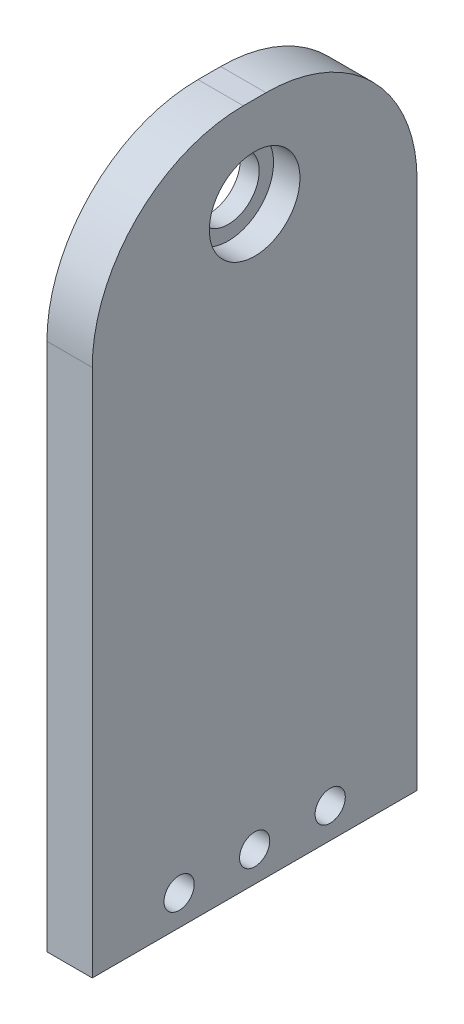
ISO-10303-21;
HEADER;
FILE_DESCRIPTION(('STEP AP214'),'2;1');
FILE_NAME('part.step','',(''),(''),'','','');
FILE_SCHEMA(('AUTOMOTIVE_DESIGN { 1 0 10303 214 1 1 1 1 }'));
ENDSEC;
DATA;
#1=APPLICATION_CONTEXT('core data for automotive mechanical design processes');
#2=APPLICATION_PROTOCOL_DEFINITION('international standard','automotive_design',2000,#1);
#3=PRODUCT_CONTEXT('',#1,'mechanical');
#4=PRODUCT('Part','Part','',(#3));
#5=PRODUCT_RELATED_PRODUCT_CATEGORY('part','',(#4));
#6=PRODUCT_DEFINITION_FORMATION('','',#4);
#7=PRODUCT_DEFINITION_CONTEXT('part definition',#1,'design');
#8=PRODUCT_DEFINITION('design','',#6,#7);
#9=PRODUCT_DEFINITION_SHAPE('','',#8);
#10=(LENGTH_UNIT() NAMED_UNIT(*) SI_UNIT(.MILLI.,.METRE.));
#11=(NAMED_UNIT(*) PLANE_ANGLE_UNIT() SI_UNIT($,.RADIAN.));
#12=(NAMED_UNIT(*) SI_UNIT($,.STERADIAN.) SOLID_ANGLE_UNIT());
#13=UNCERTAINTY_MEASURE_WITH_UNIT(LENGTH_MEASURE(1.E-05),#10,'distance_accuracy_value','');
#14=(GEOMETRIC_REPRESENTATION_CONTEXT(3) GLOBAL_UNCERTAINTY_ASSIGNED_CONTEXT((#13)) GLOBAL_UNIT_ASSIGNED_CONTEXT((#10,
#11,#12)) REPRESENTATION_CONTEXT('',''));
#15=CARTESIAN_POINT('',(0.,0.,0.));
#16=DIRECTION('',(0.,0.,1.));
#17=DIRECTION('',(1.,0.,0.));
#18=AXIS2_PLACEMENT_3D('',#15,#16,#17);
#19=CARTESIAN_POINT('',(-0.00100000000000013,33.,0.));
#20=DIRECTION('',(1.,0.,0.));
#21=DIRECTION('',(0.,0.,-1.));
#22=AXIS2_PLACEMENT_3D('',#19,#20,#21);
#23=CYLINDRICAL_SURFACE('',#22,4.1);
#24=CARTESIAN_POINT('',(0.,33.,0.));
#25=DIRECTION('',(1.,0.,0.));
#26=DIRECTION('',(0.,0.,-1.));
#27=AXIS2_PLACEMENT_3D('',#24,#25,#26);
#28=CIRCLE('',#27,4.1);
#29=CARTESIAN_POINT('',(0.,33.,-4.1));
#30=VERTEX_POINT('',#29);
#31=EDGE_CURVE('E163',#30,#30,#28,.F.);
#32=CARTESIAN_POINT('',(2.5,33.,0.));
#33=DIRECTION('',(1.,0.,0.));
#34=DIRECTION('',(0.,0.,-1.));
#35=AXIS2_PLACEMENT_3D('',#32,#33,#34);
#36=CIRCLE('',#35,4.1);
#37=CARTESIAN_POINT('',(2.5,33.,-4.1));
#38=VERTEX_POINT('',#37);
#39=EDGE_CURVE('E39',#38,#38,#36,.F.);
#40=CARTESIAN_POINT('',(0.,33.,-4.1));
#41=CARTESIAN_POINT('',(0.0260416666666667,33.,-4.1));
#42=CARTESIAN_POINT('',(0.0520833333333333,33.,-4.1));
#43=CARTESIAN_POINT('',(0.104166666666667,33.,-4.1));
#44=CARTESIAN_POINT('',(0.130208333333333,33.,-4.1));
#45=CARTESIAN_POINT('',(0.182291666666667,33.,-4.1));
#46=CARTESIAN_POINT('',(0.208333333333333,33.,-4.1));
#47=CARTESIAN_POINT('',(0.260416666666667,33.,-4.1));
#48=CARTESIAN_POINT('',(0.286458333333333,33.,-4.1));
#49=CARTESIAN_POINT('',(0.338541666666667,33.,-4.1));
#50=CARTESIAN_POINT('',(0.364583333333333,33.,-4.1));
#51=CARTESIAN_POINT('',(0.416666666666667,33.,-4.1));
#52=CARTESIAN_POINT('',(0.442708333333333,33.,-4.1));
#53=CARTESIAN_POINT('',(0.494791666666667,33.,-4.1));
#54=CARTESIAN_POINT('',(0.520833333333333,33.,-4.1));
#55=CARTESIAN_POINT('',(0.572916666666667,33.,-4.1));
#56=CARTESIAN_POINT('',(0.598958333333333,33.,-4.1));
#57=CARTESIAN_POINT('',(0.651041666666667,33.,-4.1));
#58=CARTESIAN_POINT('',(0.677083333333333,33.,-4.1));
#59=CARTESIAN_POINT('',(0.729166666666667,33.,-4.1));
#60=CARTESIAN_POINT('',(0.755208333333333,33.,-4.1));
#61=CARTESIAN_POINT('',(0.807291666666667,33.,-4.1));
#62=CARTESIAN_POINT('',(0.833333333333333,33.,-4.1));
#63=CARTESIAN_POINT('',(0.885416666666667,33.,-4.1));
#64=CARTESIAN_POINT('',(0.911458333333333,33.,-4.1));
#65=CARTESIAN_POINT('',(0.963541666666667,33.,-4.1));
#66=CARTESIAN_POINT('',(0.989583333333333,33.,-4.1));
#67=CARTESIAN_POINT('',(1.04166666666667,33.,-4.1));
#68=CARTESIAN_POINT('',(1.06770833333333,33.,-4.1));
#69=CARTESIAN_POINT('',(1.11979166666667,33.,-4.1));
#70=CARTESIAN_POINT('',(1.14583333333333,33.,-4.1));
#71=CARTESIAN_POINT('',(1.19791666666667,33.,-4.1));
#72=CARTESIAN_POINT('',(1.22395833333333,33.,-4.1));
#73=CARTESIAN_POINT('',(1.27604166666667,33.,-4.1));
#74=CARTESIAN_POINT('',(1.30208333333333,33.,-4.1));
#75=CARTESIAN_POINT('',(1.35416666666667,33.,-4.1));
#76=CARTESIAN_POINT('',(1.38020833333333,33.,-4.1));
#77=CARTESIAN_POINT('',(1.43229166666667,33.,-4.1));
#78=CARTESIAN_POINT('',(1.45833333333333,33.,-4.1));
#79=CARTESIAN_POINT('',(1.51041666666667,33.,-4.1));
#80=CARTESIAN_POINT('',(1.53645833333333,33.,-4.1));
#81=CARTESIAN_POINT('',(1.58854166666667,33.,-4.1));
#82=CARTESIAN_POINT('',(1.61458333333333,33.,-4.1));
#83=CARTESIAN_POINT('',(1.66666666666667,33.,-4.1));
#84=CARTESIAN_POINT('',(1.69270833333333,33.,-4.1));
#85=CARTESIAN_POINT('',(1.74479166666667,33.,-4.1));
#86=CARTESIAN_POINT('',(1.77083333333333,33.,-4.1));
#87=CARTESIAN_POINT('',(1.82291666666667,33.,-4.1));
#88=CARTESIAN_POINT('',(1.84895833333333,33.,-4.1));
#89=CARTESIAN_POINT('',(1.90104166666667,33.,-4.1));
#90=CARTESIAN_POINT('',(1.92708333333333,33.,-4.1));
#91=CARTESIAN_POINT('',(1.97916666666667,33.,-4.1));
#92=CARTESIAN_POINT('',(2.00520833333333,33.,-4.1));
#93=CARTESIAN_POINT('',(2.05729166666667,33.,-4.1));
#94=CARTESIAN_POINT('',(2.08333333333333,33.,-4.1));
#95=CARTESIAN_POINT('',(2.13541666666667,33.,-4.1));
#96=CARTESIAN_POINT('',(2.16145833333333,33.,-4.1));
#97=CARTESIAN_POINT('',(2.21354166666667,33.,-4.1));
#98=CARTESIAN_POINT('',(2.23958333333333,33.,-4.1));
#99=CARTESIAN_POINT('',(2.29166666666667,33.,-4.1));
#100=CARTESIAN_POINT('',(2.31770833333333,33.,-4.1));
#101=CARTESIAN_POINT('',(2.36979166666667,33.,-4.1));
#102=CARTESIAN_POINT('',(2.39583333333333,33.,-4.1));
#103=CARTESIAN_POINT('',(2.44791666666667,33.,-4.1));
#104=CARTESIAN_POINT('',(2.47395833333333,33.,-4.1));
#105=CARTESIAN_POINT('',(2.5,33.,-4.1));
#106=B_SPLINE_CURVE_WITH_KNOTS('',3,(#40,#41,#42,#43,#44,#45,#46,#47,#48,#49,#50,#51,#52,#53,
#54,#55,#56,#57,#58,#59,#60,#61,#62,#63,#64,#65,#66,#67,#68,#69,#70,#71,#72,#73,#74,#75,#76,#77,
#78,#79,#80,#81,#82,#83,#84,#85,#86,#87,#88,#89,#90,#91,#92,#93,#94,#95,#96,#97,#98,#99,#100,
#101,#102,#103,#104,#105),.UNSPECIFIED.,.F.,.F.,(4,2,2,2,2,2,2,2,2,2,2,2,2,2,2,2,2,2,2,2,2,2,2,
2,2,2,2,2,2,2,2,2,4),(0.,0.078125,0.15625,0.234375,0.3125,0.390625,0.46875,0.546875,0.625,
0.703125,0.78125,0.859375,0.9375,1.015625,1.09375,1.171875,1.25,1.328125,1.40625,1.484375,
1.5625,1.640625,1.71875,1.796875,1.875,1.953125,2.03125,2.109375,2.1875,2.265625,2.34375,
2.421875,2.5),.UNSPECIFIED.);
#107=EDGE_CURVE('BSEAM35',#30,#38,#106,.T.);
#108=ORIENTED_EDGE('',*,*,#31,.T.);
#109=ORIENTED_EDGE('',*,*,#39,.F.);
#110=ORIENTED_EDGE('',*,*,#107,.T.);
#111=ORIENTED_EDGE('',*,*,#107,.F.);
#112=EDGE_LOOP('',(#108,#110,#109,#111));
#113=FACE_BOUND('',#112,.T.);
#114=ADVANCED_FACE('F35',(#113),#23,.F.);
#115=CARTESIAN_POINT('',(6.,-45.,21.5));
#116=DIRECTION('',(0.,0.,-1.));
#117=DIRECTION('',(-1.,0.,0.));
#118=AXIS2_PLACEMENT_3D('',#115,#116,#117);
#119=PLANE('',#118);
#120=DIRECTION('',(0.,-1.,0.));
#121=VECTOR('',#120,1.);
#122=CARTESIAN_POINT('',(6.,-45.,21.5));
#123=LINE('',#122,#121);
#124=CARTESIAN_POINT('',(6.,25.,21.5));
#125=VERTEX_POINT('',#124);
#126=CARTESIAN_POINT('',(6.,-45.,21.5));
#127=VERTEX_POINT('',#126);
#128=EDGE_CURVE('E89',#125,#127,#123,.T.);
#129=ORIENTED_EDGE('',*,*,#128,.F.);
#130=DIRECTION('',(-1.,0.,0.));
#131=VECTOR('',#130,1.);
#132=CARTESIAN_POINT('',(6.,25.,21.5));
#133=LINE('',#132,#131);
#134=CARTESIAN_POINT('',(0.,25.,21.5));
#135=VERTEX_POINT('',#134);
#136=EDGE_CURVE('E11',#125,#135,#133,.T.);
#137=ORIENTED_EDGE('',*,*,#136,.T.);
#138=DIRECTION('',(0.,-1.,0.));
#139=VECTOR('',#138,1.);
#140=CARTESIAN_POINT('',(0.,-45.,21.5));
#141=LINE('',#140,#139);
#142=CARTESIAN_POINT('',(0.,-45.,21.5));
#143=VERTEX_POINT('',#142);
#144=EDGE_CURVE('E109',#135,#143,#141,.T.);
#145=ORIENTED_EDGE('',*,*,#144,.T.);
#146=DIRECTION('',(-1.,0.,0.));
#147=VECTOR('',#146,1.);
#148=CARTESIAN_POINT('',(6.,-45.,21.5));
#149=LINE('',#148,#147);
#150=EDGE_CURVE('E102',#127,#143,#149,.T.);
#151=ORIENTED_EDGE('',*,*,#150,.F.);
#152=EDGE_LOOP('',(#129,#137,#145,#151));
#153=FACE_BOUND('',#152,.T.);
#154=ADVANCED_FACE('F107',(#153),#119,.F.);
#155=CARTESIAN_POINT('',(6.,-45.,-21.5));
#156=DIRECTION('',(0.,1.,0.));
#157=DIRECTION('',(0.,0.,1.));
#158=AXIS2_PLACEMENT_3D('',#155,#156,#157);
#159=PLANE('',#158);
#160=DIRECTION('',(0.,0.,-1.));
#161=VECTOR('',#160,1.);
#162=CARTESIAN_POINT('',(0.,-45.,-21.5));
#163=LINE('',#162,#161);
#164=CARTESIAN_POINT('',(0.,-45.,-21.5));
#165=VERTEX_POINT('',#164);
#166=EDGE_CURVE('E143',#143,#165,#163,.T.);
#167=ORIENTED_EDGE('',*,*,#166,.T.);
#168=DIRECTION('',(-1.,0.,0.));
#169=VECTOR('',#168,1.);
#170=CARTESIAN_POINT('',(6.,-45.,-21.5));
#171=LINE('',#170,#169);
#172=CARTESIAN_POINT('',(6.,-45.,-21.5));
#173=VERTEX_POINT('',#172);
#174=EDGE_CURVE('E104',#173,#165,#171,.T.);
#175=ORIENTED_EDGE('',*,*,#174,.F.);
#176=DIRECTION('',(0.,0.,-1.));
#177=VECTOR('',#176,1.);
#178=CARTESIAN_POINT('',(6.,-45.,-21.5));
#179=LINE('',#178,#177);
#180=EDGE_CURVE('E92',#127,#173,#179,.T.);
#181=ORIENTED_EDGE('',*,*,#180,.F.);
#182=ORIENTED_EDGE('',*,*,#150,.T.);
#183=EDGE_LOOP('',(#167,#175,#181,#182));
#184=FACE_BOUND('',#183,.T.);
#185=ADVANCED_FACE('F101',(#184),#159,.F.);
#186=CARTESIAN_POINT('',(6.,-45.,-21.5));
#187=DIRECTION('',(0.,0.,1.));
#188=DIRECTION('',(1.,0.,0.));
#189=AXIS2_PLACEMENT_3D('',#186,#187,#188);
#190=PLANE('',#189);
#191=DIRECTION('',(0.,1.,0.));
#192=VECTOR('',#191,1.);
#193=CARTESIAN_POINT('',(0.,-45.,-21.5));
#194=LINE('',#193,#192);
#195=CARTESIAN_POINT('',(0.,25.,-21.5));
#196=VERTEX_POINT('',#195);
#197=EDGE_CURVE('E141',#165,#196,#194,.T.);
#198=ORIENTED_EDGE('',*,*,#197,.T.);
#199=DIRECTION('',(-1.,0.,0.));
#200=VECTOR('',#199,1.);
#201=CARTESIAN_POINT('',(6.,25.,-21.5));
#202=LINE('',#201,#200);
#203=CARTESIAN_POINT('',(6.,25.,-21.5));
#204=VERTEX_POINT('',#203);
#205=EDGE_CURVE('E59',#196,#204,#202,.F.);
#206=ORIENTED_EDGE('',*,*,#205,.T.);
#207=DIRECTION('',(0.,1.,0.));
#208=VECTOR('',#207,1.);
#209=CARTESIAN_POINT('',(6.,-45.,-21.5));
#210=LINE('',#209,#208);
#211=EDGE_CURVE('E105',#173,#204,#210,.T.);
#212=ORIENTED_EDGE('',*,*,#211,.F.);
#213=ORIENTED_EDGE('',*,*,#174,.T.);
#214=EDGE_LOOP('',(#198,#206,#212,#213));
#215=FACE_BOUND('',#214,.T.);
#216=ADVANCED_FACE('F142',(#215),#190,.F.);
#217=CARTESIAN_POINT('',(6.,45.,-21.5));
#218=DIRECTION('',(0.,-1.,0.));
#219=DIRECTION('',(0.,0.,-1.));
#220=AXIS2_PLACEMENT_3D('',#217,#218,#219);
#221=PLANE('',#220);
#222=DIRECTION('',(0.,0.,1.));
#223=VECTOR('',#222,1.);
#224=CARTESIAN_POINT('',(6.,45.,-21.5));
#225=LINE('',#224,#223);
#226=CARTESIAN_POINT('',(6.,45.,-1.5));
#227=VERTEX_POINT('',#226);
#228=CARTESIAN_POINT('',(6.,45.,1.5));
#229=VERTEX_POINT('',#228);
#230=EDGE_CURVE('E115',#227,#229,#225,.T.);
#231=ORIENTED_EDGE('',*,*,#230,.F.);
#232=DIRECTION('',(-1.,0.,0.));
#233=VECTOR('',#232,1.);
#234=CARTESIAN_POINT('',(6.,45.,-1.5));
#235=LINE('',#234,#233);
#236=CARTESIAN_POINT('',(0.,45.,-1.5));
#237=VERTEX_POINT('',#236);
#238=EDGE_CURVE('E113',#227,#237,#235,.T.);
#239=ORIENTED_EDGE('',*,*,#238,.T.);
#240=DIRECTION('',(0.,0.,1.));
#241=VECTOR('',#240,1.);
#242=CARTESIAN_POINT('',(0.,45.,-21.5));
#243=LINE('',#242,#241);
#244=CARTESIAN_POINT('',(0.,45.,1.5));
#245=VERTEX_POINT('',#244);
#246=EDGE_CURVE('E97',#237,#245,#243,.T.);
#247=ORIENTED_EDGE('',*,*,#246,.T.);
#248=DIRECTION('',(-1.,0.,0.));
#249=VECTOR('',#248,1.);
#250=CARTESIAN_POINT('',(6.,45.,1.5));
#251=LINE('',#250,#249);
#252=EDGE_CURVE('E111',#245,#229,#251,.F.);
#253=ORIENTED_EDGE('',*,*,#252,.T.);
#254=EDGE_LOOP('',(#231,#239,#247,#253));
#255=FACE_BOUND('',#254,.T.);
#256=ADVANCED_FACE('F132',(#255),#221,.F.);
#257=CARTESIAN_POINT('',(6.,0.,0.));
#258=DIRECTION('',(1.,0.,0.));
#259=DIRECTION('',(0.,0.,-1.));
#260=AXIS2_PLACEMENT_3D('',#257,#258,#259);
#261=PLANE('',#260);
#262=CARTESIAN_POINT('',(6.,33.,0.));
#263=DIRECTION('',(1.,0.,0.));
#264=DIRECTION('',(0.,0.,-1.));
#265=AXIS2_PLACEMENT_3D('',#262,#263,#264);
#266=CIRCLE('',#265,6.);
#267=CARTESIAN_POINT('',(6.,33.,-6.));
#268=VERTEX_POINT('',#267);
#269=EDGE_CURVE('E170',#268,#268,#266,.T.);
#270=ORIENTED_EDGE('',*,*,#269,.F.);
#271=EDGE_LOOP('',(#270));
#272=FACE_BOUND('',#271,.T.);
#273=CARTESIAN_POINT('',(6.,-41.0000000000001,10.));
#274=DIRECTION('',(1.,0.,0.));
#275=DIRECTION('',(0.,0.,-1.));
#276=AXIS2_PLACEMENT_3D('',#273,#274,#275);
#277=CIRCLE('',#276,2.);
#278=CARTESIAN_POINT('',(6.,-41.0000000000001,8.));
#279=VERTEX_POINT('',#278);
#280=EDGE_CURVE('E160',#279,#279,#277,.T.);
#281=ORIENTED_EDGE('',*,*,#280,.F.);
#282=EDGE_LOOP('',(#281));
#283=FACE_BOUND('',#282,.T.);
#284=CARTESIAN_POINT('',(6.,-41.,-10.));
#285=DIRECTION('',(1.,0.,0.));
#286=DIRECTION('',(0.,0.,-1.));
#287=AXIS2_PLACEMENT_3D('',#284,#285,#286);
#288=CIRCLE('',#287,2.);
#289=CARTESIAN_POINT('',(6.,-41.,-12.));
#290=VERTEX_POINT('',#289);
#291=EDGE_CURVE('E159',#290,#290,#288,.T.);
#292=ORIENTED_EDGE('',*,*,#291,.F.);
#293=EDGE_LOOP('',(#292));
#294=FACE_BOUND('',#293,.T.);
#295=CARTESIAN_POINT('',(6.,-41.,0.));
#296=DIRECTION('',(1.,0.,0.));
#297=DIRECTION('',(0.,0.,-1.));
#298=AXIS2_PLACEMENT_3D('',#295,#296,#297);
#299=CIRCLE('',#298,2.00000000000001);
#300=CARTESIAN_POINT('',(6.,-41.,-2.));
#301=VERTEX_POINT('',#300);
#302=EDGE_CURVE('E152',#301,#301,#299,.T.);
#303=ORIENTED_EDGE('',*,*,#302,.F.);
#304=EDGE_LOOP('',(#303));
#305=FACE_BOUND('',#304,.T.);
#306=ORIENTED_EDGE('',*,*,#211,.T.);
#307=CARTESIAN_POINT('',(6.,25.,-1.5));
#308=DIRECTION('',(1.,0.,0.));
#309=DIRECTION('',(0.,0.,-1.));
#310=AXIS2_PLACEMENT_3D('',#307,#308,#309);
#311=CIRCLE('',#310,20.);
#312=EDGE_CURVE('E44',#204,#227,#311,.T.);
#313=ORIENTED_EDGE('',*,*,#312,.T.);
#314=ORIENTED_EDGE('',*,*,#230,.T.);
#315=CARTESIAN_POINT('',(6.,25.,1.5));
#316=DIRECTION('',(1.,0.,0.));
#317=DIRECTION('',(0.,0.,-1.));
#318=AXIS2_PLACEMENT_3D('',#315,#316,#317);
#319=CIRCLE('',#318,20.);
#320=EDGE_CURVE('E51',#229,#125,#319,.T.);
#321=ORIENTED_EDGE('',*,*,#320,.T.);
#322=ORIENTED_EDGE('',*,*,#128,.T.);
#323=ORIENTED_EDGE('',*,*,#180,.T.);
#324=EDGE_LOOP('',(#306,#313,#314,#321,#322,#323));
#325=FACE_BOUND('',#324,.T.);
#326=ADVANCED_FACE('F91',(#272,#283,#294,#305,#325),#261,.T.);
#327=CARTESIAN_POINT('',(0.,0.,0.));
#328=DIRECTION('',(1.,0.,0.));
#329=DIRECTION('',(0.,0.,-1.));
#330=AXIS2_PLACEMENT_3D('',#327,#328,#329);
#331=PLANE('',#330);
#332=ORIENTED_EDGE('',*,*,#31,.F.);
#333=EDGE_LOOP('',(#332));
#334=FACE_BOUND('',#333,.T.);
#335=CARTESIAN_POINT('',(0.,-41.0000000000001,10.));
#336=DIRECTION('',(1.,0.,0.));
#337=DIRECTION('',(0.,0.,-1.));
#338=AXIS2_PLACEMENT_3D('',#335,#336,#337);
#339=CIRCLE('',#338,2.);
#340=CARTESIAN_POINT('',(0.,-41.0000000000001,8.));
#341=VERTEX_POINT('',#340);
#342=EDGE_CURVE('E156',#341,#341,#339,.F.);
#343=ORIENTED_EDGE('',*,*,#342,.F.);
#344=EDGE_LOOP('',(#343));
#345=FACE_BOUND('',#344,.T.);
#346=CARTESIAN_POINT('',(0.,-41.,-10.));
#347=DIRECTION('',(1.,0.,0.));
#348=DIRECTION('',(0.,0.,-1.));
#349=AXIS2_PLACEMENT_3D('',#346,#347,#348);
#350=CIRCLE('',#349,2.);
#351=CARTESIAN_POINT('',(0.,-41.,-12.));
#352=VERTEX_POINT('',#351);
#353=EDGE_CURVE('E155',#352,#352,#350,.F.);
#354=ORIENTED_EDGE('',*,*,#353,.F.);
#355=EDGE_LOOP('',(#354));
#356=FACE_BOUND('',#355,.T.);
#357=CARTESIAN_POINT('',(0.,-41.,0.));
#358=DIRECTION('',(1.,0.,0.));
#359=DIRECTION('',(0.,0.,-1.));
#360=AXIS2_PLACEMENT_3D('',#357,#358,#359);
#361=CIRCLE('',#360,2.00000000000001);
#362=CARTESIAN_POINT('',(0.,-41.,-2.));
#363=VERTEX_POINT('',#362);
#364=EDGE_CURVE('E147',#363,#363,#361,.F.);
#365=ORIENTED_EDGE('',*,*,#364,.F.);
#366=EDGE_LOOP('',(#365));
#367=FACE_BOUND('',#366,.T.);
#368=ORIENTED_EDGE('',*,*,#246,.F.);
#369=CARTESIAN_POINT('',(0.,25.,-1.5));
#370=DIRECTION('',(1.,0.,0.));
#371=DIRECTION('',(0.,0.,-1.));
#372=AXIS2_PLACEMENT_3D('',#369,#370,#371);
#373=CIRCLE('',#372,20.);
#374=EDGE_CURVE('E123',#237,#196,#373,.F.);
#375=ORIENTED_EDGE('',*,*,#374,.T.);
#376=ORIENTED_EDGE('',*,*,#197,.F.);
#377=ORIENTED_EDGE('',*,*,#166,.F.);
#378=ORIENTED_EDGE('',*,*,#144,.F.);
#379=CARTESIAN_POINT('',(0.,25.,1.5));
#380=DIRECTION('',(1.,0.,0.));
#381=DIRECTION('',(0.,0.,-1.));
#382=AXIS2_PLACEMENT_3D('',#379,#380,#381);
#383=CIRCLE('',#382,20.);
#384=EDGE_CURVE('E121',#135,#245,#383,.F.);
#385=ORIENTED_EDGE('',*,*,#384,.T.);
#386=EDGE_LOOP('',(#368,#375,#376,#377,#378,#385));
#387=FACE_BOUND('',#386,.T.);
#388=ADVANCED_FACE('F140',(#334,#345,#356,#367,#387),#331,.F.);
#389=CARTESIAN_POINT('',(-0.00100000000000013,-41.,0.));
#390=DIRECTION('',(1.,0.,0.));
#391=DIRECTION('',(0.,0.,-1.));
#392=AXIS2_PLACEMENT_3D('',#389,#390,#391);
#393=CYLINDRICAL_SURFACE('',#392,2.00000000000001);
#394=CARTESIAN_POINT('',(6.,-41.,-2.));
#395=CARTESIAN_POINT('',(5.9375,-41.,-2.));
#396=CARTESIAN_POINT('',(5.875,-41.,-2.));
#397=CARTESIAN_POINT('',(5.75,-41.,-2.));
#398=CARTESIAN_POINT('',(5.6875,-41.,-2.));
#399=CARTESIAN_POINT('',(5.5625,-41.,-2.));
#400=CARTESIAN_POINT('',(5.5,-41.,-2.));
#401=CARTESIAN_POINT('',(5.375,-41.,-2.));
#402=CARTESIAN_POINT('',(5.3125,-41.,-2.));
#403=CARTESIAN_POINT('',(5.1875,-41.,-2.));
#404=CARTESIAN_POINT('',(5.125,-41.,-2.));
#405=CARTESIAN_POINT('',(5.,-41.,-2.));
#406=CARTESIAN_POINT('',(4.9375,-41.,-2.));
#407=CARTESIAN_POINT('',(4.8125,-41.,-2.));
#408=CARTESIAN_POINT('',(4.75,-41.,-2.));
#409=CARTESIAN_POINT('',(4.625,-41.,-2.));
#410=CARTESIAN_POINT('',(4.5625,-41.,-2.));
#411=CARTESIAN_POINT('',(4.4375,-41.,-2.));
#412=CARTESIAN_POINT('',(4.375,-41.,-2.));
#413=CARTESIAN_POINT('',(4.25,-41.,-2.));
#414=CARTESIAN_POINT('',(4.1875,-41.,-2.));
#415=CARTESIAN_POINT('',(4.0625,-41.,-2.));
#416=CARTESIAN_POINT('',(4.,-41.,-2.));
#417=CARTESIAN_POINT('',(3.875,-41.,-2.));
#418=CARTESIAN_POINT('',(3.8125,-41.,-2.));
#419=CARTESIAN_POINT('',(3.6875,-41.,-2.));
#420=CARTESIAN_POINT('',(3.625,-41.,-2.));
#421=CARTESIAN_POINT('',(3.5,-41.,-2.));
#422=CARTESIAN_POINT('',(3.4375,-41.,-2.));
#423=CARTESIAN_POINT('',(3.3125,-41.,-2.));
#424=CARTESIAN_POINT('',(3.25,-41.,-2.));
#425=CARTESIAN_POINT('',(3.125,-41.,-2.));
#426=CARTESIAN_POINT('',(3.0625,-41.,-2.));
#427=CARTESIAN_POINT('',(2.9375,-41.,-2.));
#428=CARTESIAN_POINT('',(2.875,-41.,-2.));
#429=CARTESIAN_POINT('',(2.75,-41.,-2.));
#430=CARTESIAN_POINT('',(2.6875,-41.,-2.));
#431=CARTESIAN_POINT('',(2.5625,-41.,-2.));
#432=CARTESIAN_POINT('',(2.5,-41.,-2.));
#433=CARTESIAN_POINT('',(2.375,-41.,-2.));
#434=CARTESIAN_POINT('',(2.3125,-41.,-2.));
#435=CARTESIAN_POINT('',(2.1875,-41.,-2.));
#436=CARTESIAN_POINT('',(2.125,-41.,-2.));
#437=CARTESIAN_POINT('',(2.,-41.,-2.));
#438=CARTESIAN_POINT('',(1.9375,-41.,-2.));
#439=CARTESIAN_POINT('',(1.8125,-41.,-2.));
#440=CARTESIAN_POINT('',(1.75,-41.,-2.));
#441=CARTESIAN_POINT('',(1.625,-41.,-2.));
#442=CARTESIAN_POINT('',(1.5625,-41.,-2.));
#443=CARTESIAN_POINT('',(1.4375,-41.,-2.));
#444=CARTESIAN_POINT('',(1.375,-41.,-2.));
#445=CARTESIAN_POINT('',(1.25,-41.,-2.));
#446=CARTESIAN_POINT('',(1.1875,-41.,-2.));
#447=CARTESIAN_POINT('',(1.0625,-41.,-2.));
#448=CARTESIAN_POINT('',(1.,-41.,-2.));
#449=CARTESIAN_POINT('',(0.875,-41.,-2.));
#450=CARTESIAN_POINT('',(0.8125,-41.,-2.));
#451=CARTESIAN_POINT('',(0.6875,-41.,-2.));
#452=CARTESIAN_POINT('',(0.625,-41.,-2.));
#453=CARTESIAN_POINT('',(0.5,-41.,-2.));
#454=CARTESIAN_POINT('',(0.4375,-41.,-2.));
#455=CARTESIAN_POINT('',(0.3125,-41.,-2.));
#456=CARTESIAN_POINT('',(0.25,-41.,-2.));
#457=CARTESIAN_POINT('',(0.125,-41.,-2.));
#458=CARTESIAN_POINT('',(0.0625000000000001,-41.,-2.));
#459=CARTESIAN_POINT('',(0.,-41.,-2.));
#460=B_SPLINE_CURVE_WITH_KNOTS('',3,(#394,#395,#396,#397,#398,#399,#400,#401,#402,#403,#404,
#405,#406,#407,#408,#409,#410,#411,#412,#413,#414,#415,#416,#417,#418,#419,#420,#421,#422,#423,
#424,#425,#426,#427,#428,#429,#430,#431,#432,#433,#434,#435,#436,#437,#438,#439,#440,#441,#442,
#443,#444,#445,#446,#447,#448,#449,#450,#451,#452,#453,#454,#455,#456,#457,#458,#459),
.UNSPECIFIED.,.F.,.F.,(4,2,2,2,2,2,2,2,2,2,2,2,2,2,2,2,2,2,2,2,2,2,2,2,2,2,2,2,2,2,2,2,4),(0.,
0.1875,0.375,0.5625,0.75,0.9375,1.125,1.3125,1.5,1.6875,1.875,2.0625,2.25,2.4375,2.625,2.8125,
3.,3.1875,3.375,3.5625,3.75,3.9375,4.125,4.3125,4.5,4.6875,4.875,5.0625,5.25,5.4375,5.625,
5.8125,6.),.UNSPECIFIED.);
#461=EDGE_CURVE('BSEAM197',#301,#363,#460,.T.);
#462=ORIENTED_EDGE('',*,*,#302,.T.);
#463=ORIENTED_EDGE('',*,*,#364,.T.);
#464=ORIENTED_EDGE('',*,*,#461,.T.);
#465=ORIENTED_EDGE('',*,*,#461,.F.);
#466=EDGE_LOOP('',(#462,#464,#463,#465));
#467=FACE_BOUND('',#466,.T.);
#468=ADVANCED_FACE('F197',(#467),#393,.F.);
#469=CARTESIAN_POINT('',(-0.00100000000000013,-41.,-10.));
#470=DIRECTION('',(1.,0.,0.));
#471=DIRECTION('',(0.,0.,-1.));
#472=AXIS2_PLACEMENT_3D('',#469,#470,#471);
#473=CYLINDRICAL_SURFACE('',#472,2.);
#474=CARTESIAN_POINT('',(6.,-41.,-12.));
#475=CARTESIAN_POINT('',(5.9375,-41.,-12.));
#476=CARTESIAN_POINT('',(5.875,-41.,-12.));
#477=CARTESIAN_POINT('',(5.75,-41.,-12.));
#478=CARTESIAN_POINT('',(5.6875,-41.,-12.));
#479=CARTESIAN_POINT('',(5.5625,-41.,-12.));
#480=CARTESIAN_POINT('',(5.5,-41.,-12.));
#481=CARTESIAN_POINT('',(5.375,-41.,-12.));
#482=CARTESIAN_POINT('',(5.3125,-41.,-12.));
#483=CARTESIAN_POINT('',(5.1875,-41.,-12.));
#484=CARTESIAN_POINT('',(5.125,-41.,-12.));
#485=CARTESIAN_POINT('',(5.,-41.,-12.));
#486=CARTESIAN_POINT('',(4.9375,-41.,-12.));
#487=CARTESIAN_POINT('',(4.8125,-41.,-12.));
#488=CARTESIAN_POINT('',(4.75,-41.,-12.));
#489=CARTESIAN_POINT('',(4.625,-41.,-12.));
#490=CARTESIAN_POINT('',(4.5625,-41.,-12.));
#491=CARTESIAN_POINT('',(4.4375,-41.,-12.));
#492=CARTESIAN_POINT('',(4.375,-41.,-12.));
#493=CARTESIAN_POINT('',(4.25,-41.,-12.));
#494=CARTESIAN_POINT('',(4.1875,-41.,-12.));
#495=CARTESIAN_POINT('',(4.0625,-41.,-12.));
#496=CARTESIAN_POINT('',(4.,-41.,-12.));
#497=CARTESIAN_POINT('',(3.875,-41.,-12.));
#498=CARTESIAN_POINT('',(3.8125,-41.,-12.));
#499=CARTESIAN_POINT('',(3.6875,-41.,-12.));
#500=CARTESIAN_POINT('',(3.625,-41.,-12.));
#501=CARTESIAN_POINT('',(3.5,-41.,-12.));
#502=CARTESIAN_POINT('',(3.4375,-41.,-12.));
#503=CARTESIAN_POINT('',(3.3125,-41.,-12.));
#504=CARTESIAN_POINT('',(3.25,-41.,-12.));
#505=CARTESIAN_POINT('',(3.125,-41.,-12.));
#506=CARTESIAN_POINT('',(3.0625,-41.,-12.));
#507=CARTESIAN_POINT('',(2.9375,-41.,-12.));
#508=CARTESIAN_POINT('',(2.875,-41.,-12.));
#509=CARTESIAN_POINT('',(2.75,-41.,-12.));
#510=CARTESIAN_POINT('',(2.6875,-41.,-12.));
#511=CARTESIAN_POINT('',(2.5625,-41.,-12.));
#512=CARTESIAN_POINT('',(2.5,-41.,-12.));
#513=CARTESIAN_POINT('',(2.375,-41.,-12.));
#514=CARTESIAN_POINT('',(2.3125,-41.,-12.));
#515=CARTESIAN_POINT('',(2.1875,-41.,-12.));
#516=CARTESIAN_POINT('',(2.125,-41.,-12.));
#517=CARTESIAN_POINT('',(2.,-41.,-12.));
#518=CARTESIAN_POINT('',(1.9375,-41.,-12.));
#519=CARTESIAN_POINT('',(1.8125,-41.,-12.));
#520=CARTESIAN_POINT('',(1.75,-41.,-12.));
#521=CARTESIAN_POINT('',(1.625,-41.,-12.));
#522=CARTESIAN_POINT('',(1.5625,-41.,-12.));
#523=CARTESIAN_POINT('',(1.4375,-41.,-12.));
#524=CARTESIAN_POINT('',(1.375,-41.,-12.));
#525=CARTESIAN_POINT('',(1.25,-41.,-12.));
#526=CARTESIAN_POINT('',(1.1875,-41.,-12.));
#527=CARTESIAN_POINT('',(1.0625,-41.,-12.));
#528=CARTESIAN_POINT('',(1.,-41.,-12.));
#529=CARTESIAN_POINT('',(0.875,-41.,-12.));
#530=CARTESIAN_POINT('',(0.8125,-41.,-12.));
#531=CARTESIAN_POINT('',(0.6875,-41.,-12.));
#532=CARTESIAN_POINT('',(0.625,-41.,-12.));
#533=CARTESIAN_POINT('',(0.5,-41.,-12.));
#534=CARTESIAN_POINT('',(0.4375,-41.,-12.));
#535=CARTESIAN_POINT('',(0.3125,-41.,-12.));
#536=CARTESIAN_POINT('',(0.25,-41.,-12.));
#537=CARTESIAN_POINT('',(0.125,-41.,-12.));
#538=CARTESIAN_POINT('',(0.0625000000000001,-41.,-12.));
#539=CARTESIAN_POINT('',(0.,-41.,-12.));
#540=B_SPLINE_CURVE_WITH_KNOTS('',3,(#474,#475,#476,#477,#478,#479,#480,#481,#482,#483,#484,
#485,#486,#487,#488,#489,#490,#491,#492,#493,#494,#495,#496,#497,#498,#499,#500,#501,#502,#503,
#504,#505,#506,#507,#508,#509,#510,#511,#512,#513,#514,#515,#516,#517,#518,#519,#520,#521,#522,
#523,#524,#525,#526,#527,#528,#529,#530,#531,#532,#533,#534,#535,#536,#537,#538,#539),
.UNSPECIFIED.,.F.,.F.,(4,2,2,2,2,2,2,2,2,2,2,2,2,2,2,2,2,2,2,2,2,2,2,2,2,2,2,2,2,2,2,2,4),(0.,
0.1875,0.375,0.5625,0.75,0.9375,1.125,1.3125,1.5,1.6875,1.875,2.0625,2.25,2.4375,2.625,2.8125,
3.,3.1875,3.375,3.5625,3.75,3.9375,4.125,4.3125,4.5,4.6875,4.875,5.0625,5.25,5.4375,5.625,
5.8125,6.),.UNSPECIFIED.);
#541=EDGE_CURVE('BSEAM193',#290,#352,#540,.T.);
#542=ORIENTED_EDGE('',*,*,#291,.T.);
#543=ORIENTED_EDGE('',*,*,#353,.T.);
#544=ORIENTED_EDGE('',*,*,#541,.T.);
#545=ORIENTED_EDGE('',*,*,#541,.F.);
#546=EDGE_LOOP('',(#542,#544,#543,#545));
#547=FACE_BOUND('',#546,.T.);
#548=ADVANCED_FACE('F193',(#547),#473,.F.);
#549=CARTESIAN_POINT('',(-0.00100000000000013,-41.0000000000001,10.));
#550=DIRECTION('',(1.,0.,0.));
#551=DIRECTION('',(0.,0.,-1.));
#552=AXIS2_PLACEMENT_3D('',#549,#550,#551);
#553=CYLINDRICAL_SURFACE('',#552,2.);
#554=CARTESIAN_POINT('',(6.,-41.0000000000001,8.));
#555=CARTESIAN_POINT('',(5.9375,-41.0000000000001,8.));
#556=CARTESIAN_POINT('',(5.875,-41.0000000000001,8.));
#557=CARTESIAN_POINT('',(5.75,-41.0000000000001,8.));
#558=CARTESIAN_POINT('',(5.6875,-41.0000000000001,8.));
#559=CARTESIAN_POINT('',(5.5625,-41.0000000000001,8.));
#560=CARTESIAN_POINT('',(5.5,-41.0000000000001,8.));
#561=CARTESIAN_POINT('',(5.375,-41.0000000000001,8.));
#562=CARTESIAN_POINT('',(5.3125,-41.0000000000001,8.));
#563=CARTESIAN_POINT('',(5.1875,-41.0000000000001,8.));
#564=CARTESIAN_POINT('',(5.125,-41.0000000000001,8.));
#565=CARTESIAN_POINT('',(5.,-41.0000000000001,8.));
#566=CARTESIAN_POINT('',(4.9375,-41.0000000000001,8.));
#567=CARTESIAN_POINT('',(4.8125,-41.0000000000001,8.));
#568=CARTESIAN_POINT('',(4.75,-41.0000000000001,8.));
#569=CARTESIAN_POINT('',(4.625,-41.0000000000001,8.));
#570=CARTESIAN_POINT('',(4.5625,-41.0000000000001,8.));
#571=CARTESIAN_POINT('',(4.4375,-41.0000000000001,8.));
#572=CARTESIAN_POINT('',(4.375,-41.0000000000001,8.));
#573=CARTESIAN_POINT('',(4.25,-41.0000000000001,8.));
#574=CARTESIAN_POINT('',(4.1875,-41.0000000000001,8.));
#575=CARTESIAN_POINT('',(4.0625,-41.0000000000001,8.));
#576=CARTESIAN_POINT('',(4.,-41.0000000000001,8.));
#577=CARTESIAN_POINT('',(3.875,-41.0000000000001,8.));
#578=CARTESIAN_POINT('',(3.8125,-41.0000000000001,8.));
#579=CARTESIAN_POINT('',(3.6875,-41.0000000000001,8.));
#580=CARTESIAN_POINT('',(3.625,-41.0000000000001,8.));
#581=CARTESIAN_POINT('',(3.5,-41.0000000000001,8.));
#582=CARTESIAN_POINT('',(3.4375,-41.0000000000001,8.));
#583=CARTESIAN_POINT('',(3.3125,-41.0000000000001,8.));
#584=CARTESIAN_POINT('',(3.25,-41.0000000000001,8.));
#585=CARTESIAN_POINT('',(3.125,-41.0000000000001,8.));
#586=CARTESIAN_POINT('',(3.0625,-41.0000000000001,8.));
#587=CARTESIAN_POINT('',(2.9375,-41.0000000000001,8.));
#588=CARTESIAN_POINT('',(2.875,-41.0000000000001,8.));
#589=CARTESIAN_POINT('',(2.75,-41.0000000000001,8.));
#590=CARTESIAN_POINT('',(2.6875,-41.0000000000001,8.));
#591=CARTESIAN_POINT('',(2.5625,-41.0000000000001,8.));
#592=CARTESIAN_POINT('',(2.5,-41.0000000000001,8.));
#593=CARTESIAN_POINT('',(2.375,-41.0000000000001,8.));
#594=CARTESIAN_POINT('',(2.3125,-41.0000000000001,8.));
#595=CARTESIAN_POINT('',(2.1875,-41.0000000000001,8.));
#596=CARTESIAN_POINT('',(2.125,-41.0000000000001,8.));
#597=CARTESIAN_POINT('',(2.,-41.0000000000001,8.));
#598=CARTESIAN_POINT('',(1.9375,-41.0000000000001,8.));
#599=CARTESIAN_POINT('',(1.8125,-41.0000000000001,8.));
#600=CARTESIAN_POINT('',(1.75,-41.0000000000001,8.));
#601=CARTESIAN_POINT('',(1.625,-41.0000000000001,8.));
#602=CARTESIAN_POINT('',(1.5625,-41.0000000000001,8.));
#603=CARTESIAN_POINT('',(1.4375,-41.0000000000001,8.));
#604=CARTESIAN_POINT('',(1.375,-41.0000000000001,8.));
#605=CARTESIAN_POINT('',(1.25,-41.0000000000001,8.));
#606=CARTESIAN_POINT('',(1.1875,-41.0000000000001,8.));
#607=CARTESIAN_POINT('',(1.0625,-41.0000000000001,8.));
#608=CARTESIAN_POINT('',(1.,-41.0000000000001,8.));
#609=CARTESIAN_POINT('',(0.875,-41.0000000000001,8.));
#610=CARTESIAN_POINT('',(0.8125,-41.0000000000001,8.));
#611=CARTESIAN_POINT('',(0.6875,-41.0000000000001,8.));
#612=CARTESIAN_POINT('',(0.625,-41.0000000000001,8.));
#613=CARTESIAN_POINT('',(0.5,-41.0000000000001,8.));
#614=CARTESIAN_POINT('',(0.4375,-41.0000000000001,8.));
#615=CARTESIAN_POINT('',(0.3125,-41.0000000000001,8.));
#616=CARTESIAN_POINT('',(0.25,-41.0000000000001,8.));
#617=CARTESIAN_POINT('',(0.125,-41.0000000000001,8.));
#618=CARTESIAN_POINT('',(0.0625000000000001,-41.0000000000001,8.));
#619=CARTESIAN_POINT('',(0.,-41.0000000000001,8.));
#620=B_SPLINE_CURVE_WITH_KNOTS('',3,(#554,#555,#556,#557,#558,#559,#560,#561,#562,#563,#564,
#565,#566,#567,#568,#569,#570,#571,#572,#573,#574,#575,#576,#577,#578,#579,#580,#581,#582,#583,
#584,#585,#586,#587,#588,#589,#590,#591,#592,#593,#594,#595,#596,#597,#598,#599,#600,#601,#602,
#603,#604,#605,#606,#607,#608,#609,#610,#611,#612,#613,#614,#615,#616,#617,#618,#619),
.UNSPECIFIED.,.F.,.F.,(4,2,2,2,2,2,2,2,2,2,2,2,2,2,2,2,2,2,2,2,2,2,2,2,2,2,2,2,2,2,2,2,4),(0.,
0.1875,0.375,0.5625,0.75,0.9375,1.125,1.3125,1.5,1.6875,1.875,2.0625,2.25,2.4375,2.625,2.8125,
3.,3.1875,3.375,3.5625,3.75,3.9375,4.125,4.3125,4.5,4.6875,4.875,5.0625,5.25,5.4375,5.625,
5.8125,6.),.UNSPECIFIED.);
#621=EDGE_CURVE('BSEAM196',#279,#341,#620,.T.);
#622=ORIENTED_EDGE('',*,*,#280,.T.);
#623=ORIENTED_EDGE('',*,*,#342,.T.);
#624=ORIENTED_EDGE('',*,*,#621,.T.);
#625=ORIENTED_EDGE('',*,*,#621,.F.);
#626=EDGE_LOOP('',(#622,#624,#623,#625));
#627=FACE_BOUND('',#626,.T.);
#628=ADVANCED_FACE('F196',(#627),#553,.F.);
#629=CARTESIAN_POINT('',(6.,25.,-1.5));
#630=DIRECTION('',(-1.,0.,0.));
#631=DIRECTION('',(0.,0.,1.));
#632=AXIS2_PLACEMENT_3D('',#629,#630,#631);
#633=CYLINDRICAL_SURFACE('',#632,20.);
#634=ORIENTED_EDGE('',*,*,#312,.F.);
#635=ORIENTED_EDGE('',*,*,#205,.F.);
#636=ORIENTED_EDGE('',*,*,#374,.F.);
#637=ORIENTED_EDGE('',*,*,#238,.F.);
#638=EDGE_LOOP('',(#634,#635,#636,#637));
#639=FACE_BOUND('',#638,.T.);
#640=ADVANCED_FACE('F137',(#639),#633,.T.);
#641=CARTESIAN_POINT('',(6.,25.,1.5));
#642=DIRECTION('',(-1.,0.,0.));
#643=DIRECTION('',(0.,0.,1.));
#644=AXIS2_PLACEMENT_3D('',#641,#642,#643);
#645=CYLINDRICAL_SURFACE('',#644,20.);
#646=ORIENTED_EDGE('',*,*,#320,.F.);
#647=ORIENTED_EDGE('',*,*,#252,.F.);
#648=ORIENTED_EDGE('',*,*,#384,.F.);
#649=ORIENTED_EDGE('',*,*,#136,.F.);
#650=EDGE_LOOP('',(#646,#647,#648,#649));
#651=FACE_BOUND('',#650,.T.);
#652=ADVANCED_FACE('F37',(#651),#645,.T.);
#653=CARTESIAN_POINT('',(2.5,33.,0.));
#654=DIRECTION('',(1.,0.,0.));
#655=DIRECTION('',(0.,0.,-1.));
#656=AXIS2_PLACEMENT_3D('',#653,#654,#655);
#657=PLANE('',#656);
#658=CARTESIAN_POINT('',(2.5,33.,0.));
#659=DIRECTION('',(1.,0.,0.));
#660=DIRECTION('',(0.,0.,-1.));
#661=AXIS2_PLACEMENT_3D('',#658,#659,#660);
#662=CIRCLE('',#661,6.);
#663=CARTESIAN_POINT('',(2.5,33.,-6.));
#664=VERTEX_POINT('',#663);
#665=EDGE_CURVE('E173',#664,#664,#662,.T.);
#666=ORIENTED_EDGE('',*,*,#665,.T.);
#667=EDGE_LOOP('',(#666));
#668=FACE_BOUND('',#667,.T.);
#669=ORIENTED_EDGE('',*,*,#39,.T.);
#670=EDGE_LOOP('',(#669));
#671=FACE_BOUND('',#670,.T.);
#672=ADVANCED_FACE('F180',(#668,#671),#657,.T.);
#673=CARTESIAN_POINT('',(2.5,33.,0.));
#674=DIRECTION('',(1.,0.,0.));
#675=DIRECTION('',(0.,0.,-1.));
#676=AXIS2_PLACEMENT_3D('',#673,#674,#675);
#677=CYLINDRICAL_SURFACE('',#676,6.);
#678=ORIENTED_EDGE('',*,*,#665,.F.);
#679=EDGE_LOOP('',(#678));
#680=FACE_BOUND('',#679,.T.);
#681=ORIENTED_EDGE('',*,*,#269,.T.);
#682=EDGE_LOOP('',(#681));
#683=FACE_BOUND('',#682,.T.);
#684=ADVANCED_FACE('F191',(#680,#683),#677,.F.);
#685=CLOSED_SHELL('',(#114,#154,#185,#216,#256,#326,#388,#468,#548,#628,#640,#652,#672,#684));
#686=MANIFOLD_SOLID_BREP('B2',#685);
#687=ADVANCED_BREP_SHAPE_REPRESENTATION('',(#18,#686),#14);
#688=SHAPE_DEFINITION_REPRESENTATION(#9,#687);
ENDSEC;
END-ISO-10303-21;
